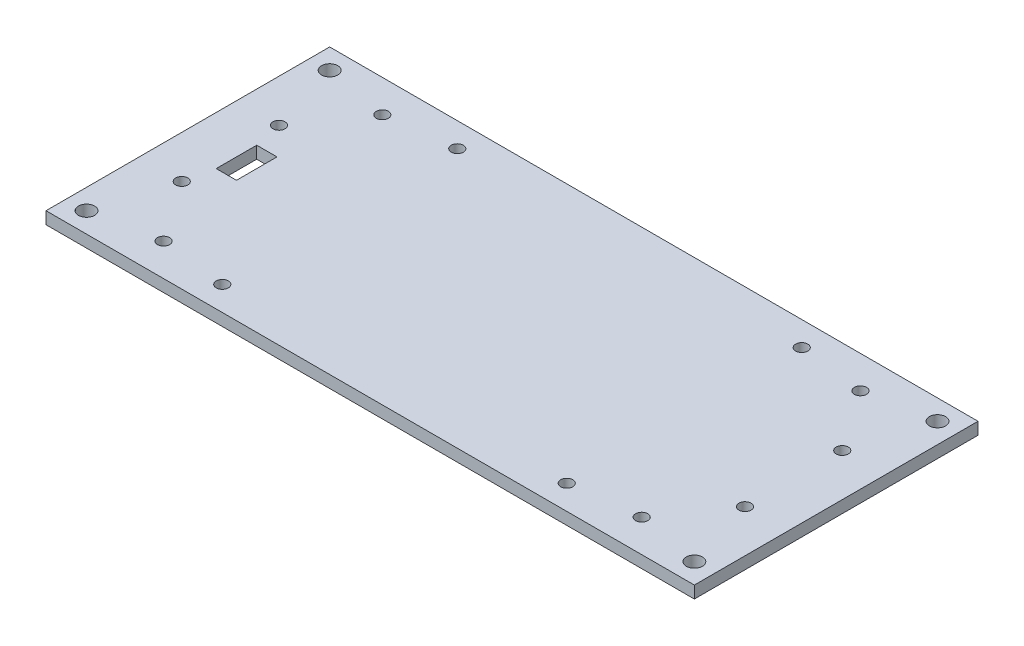
ISO-10303-21;
HEADER;
FILE_DESCRIPTION(('STEP AP214'),'2;1');
FILE_NAME('part.step','',(''),(''),'','','');
FILE_SCHEMA(('AUTOMOTIVE_DESIGN { 1 0 10303 214 1 1 1 1 }'));
ENDSEC;
DATA;
#1=APPLICATION_CONTEXT('core data for automotive mechanical design processes');
#2=APPLICATION_PROTOCOL_DEFINITION('international standard','automotive_design',2000,#1);
#3=PRODUCT_CONTEXT('',#1,'mechanical');
#4=PRODUCT('Part','Part','',(#3));
#5=PRODUCT_RELATED_PRODUCT_CATEGORY('part','',(#4));
#6=PRODUCT_DEFINITION_FORMATION('','',#4);
#7=PRODUCT_DEFINITION_CONTEXT('part definition',#1,'design');
#8=PRODUCT_DEFINITION('design','',#6,#7);
#9=PRODUCT_DEFINITION_SHAPE('','',#8);
#10=(LENGTH_UNIT() NAMED_UNIT(*) SI_UNIT(.MILLI.,.METRE.));
#11=(NAMED_UNIT(*) PLANE_ANGLE_UNIT() SI_UNIT($,.RADIAN.));
#12=(NAMED_UNIT(*) SI_UNIT($,.STERADIAN.) SOLID_ANGLE_UNIT());
#13=UNCERTAINTY_MEASURE_WITH_UNIT(LENGTH_MEASURE(1.E-05),#10,'distance_accuracy_value','');
#14=(GEOMETRIC_REPRESENTATION_CONTEXT(3) GLOBAL_UNCERTAINTY_ASSIGNED_CONTEXT((#13)) GLOBAL_UNIT_ASSIGNED_CONTEXT((#10,
#11,#12)) REPRESENTATION_CONTEXT('',''));
#15=CARTESIAN_POINT('',(0.,0.,0.));
#16=DIRECTION('',(0.,0.,1.));
#17=DIRECTION('',(1.,0.,0.));
#18=AXIS2_PLACEMENT_3D('',#15,#16,#17);
#19=CARTESIAN_POINT('',(80.,3.,-35.));
#20=DIRECTION('',(-1.,0.,0.));
#21=DIRECTION('',(0.,0.,1.));
#22=AXIS2_PLACEMENT_3D('',#19,#20,#21);
#23=PLANE('',#22);
#24=DIRECTION('',(0.,0.,-1.));
#25=VECTOR('',#24,1.);
#26=CARTESIAN_POINT('',(80.,0.,-35.));
#27=LINE('',#26,#25);
#28=CARTESIAN_POINT('',(80.,0.,35.));
#29=VERTEX_POINT('',#28);
#30=CARTESIAN_POINT('',(80.,0.,-35.));
#31=VERTEX_POINT('',#30);
#32=EDGE_CURVE('E206',#29,#31,#27,.T.);
#33=ORIENTED_EDGE('',*,*,#32,.T.);
#34=DIRECTION('',(0.,-1.,0.));
#35=VECTOR('',#34,1.);
#36=CARTESIAN_POINT('',(80.,3.,-35.));
#37=LINE('',#36,#35);
#38=CARTESIAN_POINT('',(80.,3.,-35.));
#39=VERTEX_POINT('',#38);
#40=EDGE_CURVE('E11',#39,#31,#37,.T.);
#41=ORIENTED_EDGE('',*,*,#40,.F.);
#42=DIRECTION('',(0.,0.,-1.));
#43=VECTOR('',#42,1.);
#44=CARTESIAN_POINT('',(80.,3.,-35.));
#45=LINE('',#44,#43);
#46=CARTESIAN_POINT('',(80.,3.,35.));
#47=VERTEX_POINT('',#46);
#48=EDGE_CURVE('E195',#47,#39,#45,.T.);
#49=ORIENTED_EDGE('',*,*,#48,.F.);
#50=DIRECTION('',(0.,-1.,0.));
#51=VECTOR('',#50,1.);
#52=CARTESIAN_POINT('',(80.,3.,35.));
#53=LINE('',#52,#51);
#54=EDGE_CURVE('E205',#47,#29,#53,.T.);
#55=ORIENTED_EDGE('',*,*,#54,.T.);
#56=EDGE_LOOP('',(#33,#41,#49,#55));
#57=FACE_BOUND('',#56,.T.);
#58=ADVANCED_FACE('F35',(#57),#23,.F.);
#59=CARTESIAN_POINT('',(-80.,3.,-35.));
#60=DIRECTION('',(0.,0.,1.));
#61=DIRECTION('',(1.,0.,0.));
#62=AXIS2_PLACEMENT_3D('',#59,#60,#61);
#63=PLANE('',#62);
#64=DIRECTION('',(-1.,0.,0.));
#65=VECTOR('',#64,1.);
#66=CARTESIAN_POINT('',(-80.,0.,-35.));
#67=LINE('',#66,#65);
#68=CARTESIAN_POINT('',(-80.,0.,-35.));
#69=VERTEX_POINT('',#68);
#70=EDGE_CURVE('E209',#31,#69,#67,.T.);
#71=ORIENTED_EDGE('',*,*,#70,.T.);
#72=DIRECTION('',(0.,-1.,0.));
#73=VECTOR('',#72,1.);
#74=CARTESIAN_POINT('',(-80.,3.,-35.));
#75=LINE('',#74,#73);
#76=CARTESIAN_POINT('',(-80.,3.,-35.));
#77=VERTEX_POINT('',#76);
#78=EDGE_CURVE('E43',#77,#69,#75,.T.);
#79=ORIENTED_EDGE('',*,*,#78,.F.);
#80=DIRECTION('',(-1.,0.,0.));
#81=VECTOR('',#80,1.);
#82=CARTESIAN_POINT('',(-80.,3.,-35.));
#83=LINE('',#82,#81);
#84=EDGE_CURVE('E198',#39,#77,#83,.T.);
#85=ORIENTED_EDGE('',*,*,#84,.F.);
#86=ORIENTED_EDGE('',*,*,#40,.T.);
#87=EDGE_LOOP('',(#71,#79,#85,#86));
#88=FACE_BOUND('',#87,.T.);
#89=ADVANCED_FACE('F274',(#88),#63,.F.);
#90=CARTESIAN_POINT('',(-80.,3.,-35.));
#91=DIRECTION('',(1.,0.,0.));
#92=DIRECTION('',(0.,0.,-1.));
#93=AXIS2_PLACEMENT_3D('',#90,#91,#92);
#94=PLANE('',#93);
#95=DIRECTION('',(0.,0.,1.));
#96=VECTOR('',#95,1.);
#97=CARTESIAN_POINT('',(-80.,0.,-35.));
#98=LINE('',#97,#96);
#99=CARTESIAN_POINT('',(-80.,0.,35.));
#100=VERTEX_POINT('',#99);
#101=EDGE_CURVE('E211',#69,#100,#98,.T.);
#102=ORIENTED_EDGE('',*,*,#101,.T.);
#103=DIRECTION('',(0.,-1.,0.));
#104=VECTOR('',#103,1.);
#105=CARTESIAN_POINT('',(-80.,3.,35.));
#106=LINE('',#105,#104);
#107=CARTESIAN_POINT('',(-80.,3.,35.));
#108=VERTEX_POINT('',#107);
#109=EDGE_CURVE('E216',#108,#100,#106,.T.);
#110=ORIENTED_EDGE('',*,*,#109,.F.);
#111=DIRECTION('',(0.,0.,1.));
#112=VECTOR('',#111,1.);
#113=CARTESIAN_POINT('',(-80.,3.,-35.));
#114=LINE('',#113,#112);
#115=EDGE_CURVE('E201',#77,#108,#114,.T.);
#116=ORIENTED_EDGE('',*,*,#115,.F.);
#117=ORIENTED_EDGE('',*,*,#78,.T.);
#118=EDGE_LOOP('',(#102,#110,#116,#117));
#119=FACE_BOUND('',#118,.T.);
#120=ADVANCED_FACE('F279',(#119),#94,.F.);
#121=CARTESIAN_POINT('',(-80.,3.,35.));
#122=DIRECTION('',(0.,0.,-1.));
#123=DIRECTION('',(-1.,0.,0.));
#124=AXIS2_PLACEMENT_3D('',#121,#122,#123);
#125=PLANE('',#124);
#126=DIRECTION('',(1.,0.,0.));
#127=VECTOR('',#126,1.);
#128=CARTESIAN_POINT('',(-80.,0.,35.));
#129=LINE('',#128,#127);
#130=EDGE_CURVE('E199',#100,#29,#129,.T.);
#131=ORIENTED_EDGE('',*,*,#130,.T.);
#132=ORIENTED_EDGE('',*,*,#54,.F.);
#133=DIRECTION('',(1.,0.,0.));
#134=VECTOR('',#133,1.);
#135=CARTESIAN_POINT('',(-80.,3.,35.));
#136=LINE('',#135,#134);
#137=EDGE_CURVE('E203',#108,#47,#136,.T.);
#138=ORIENTED_EDGE('',*,*,#137,.F.);
#139=ORIENTED_EDGE('',*,*,#109,.T.);
#140=EDGE_LOOP('',(#131,#132,#138,#139));
#141=FACE_BOUND('',#140,.T.);
#142=ADVANCED_FACE('F295',(#141),#125,.F.);
#143=CARTESIAN_POINT('',(0.,3.,0.));
#144=DIRECTION('',(0.,1.,0.));
#145=DIRECTION('',(0.,0.,1.));
#146=AXIS2_PLACEMENT_3D('',#143,#144,#145);
#147=PLANE('',#146);
#148=DIRECTION('',(0.,0.,-1.));
#149=VECTOR('',#148,1.);
#150=CARTESIAN_POINT('',(-63.,3.,0.));
#151=LINE('',#150,#149);
#152=CARTESIAN_POINT('',(-63.,3.,5.));
#153=VERTEX_POINT('',#152);
#154=CARTESIAN_POINT('',(-63.,3.,-5.));
#155=VERTEX_POINT('',#154);
#156=EDGE_CURVE('E134',#153,#155,#151,.T.);
#157=ORIENTED_EDGE('',*,*,#156,.F.);
#158=DIRECTION('',(1.,0.,0.));
#159=VECTOR('',#158,1.);
#160=CARTESIAN_POINT('',(0.,3.,5.));
#161=LINE('',#160,#159);
#162=CARTESIAN_POINT('',(-68.,3.,5.));
#163=VERTEX_POINT('',#162);
#164=EDGE_CURVE('E127',#163,#153,#161,.T.);
#165=ORIENTED_EDGE('',*,*,#164,.F.);
#166=DIRECTION('',(0.,0.,1.));
#167=VECTOR('',#166,1.);
#168=CARTESIAN_POINT('',(-68.,3.,0.));
#169=LINE('',#168,#167);
#170=CARTESIAN_POINT('',(-68.,3.,-5.));
#171=VERTEX_POINT('',#170);
#172=EDGE_CURVE('E107',#171,#163,#169,.T.);
#173=ORIENTED_EDGE('',*,*,#172,.F.);
#174=DIRECTION('',(-1.,0.,0.));
#175=VECTOR('',#174,1.);
#176=CARTESIAN_POINT('',(0.,3.,-5.));
#177=LINE('',#176,#175);
#178=EDGE_CURVE('E132',#155,#171,#177,.T.);
#179=ORIENTED_EDGE('',*,*,#178,.F.);
#180=EDGE_LOOP('',(#157,#165,#173,#179));
#181=FACE_BOUND('',#180,.T.);
#182=CARTESIAN_POINT('',(-42.5,3.,29.));
#183=DIRECTION('',(0.,1.,0.));
#184=DIRECTION('',(0.,0.,1.));
#185=AXIS2_PLACEMENT_3D('',#182,#183,#184);
#186=CIRCLE('',#185,1.5);
#187=CARTESIAN_POINT('',(-42.5,3.,30.5));
#188=VERTEX_POINT('',#187);
#189=EDGE_CURVE('E137',#188,#188,#186,.T.);
#190=ORIENTED_EDGE('',*,*,#189,.F.);
#191=EDGE_LOOP('',(#190));
#192=FACE_BOUND('',#191,.T.);
#193=CARTESIAN_POINT('',(42.5,3.,29.));
#194=DIRECTION('',(0.,1.,0.));
#195=DIRECTION('',(0.,0.,1.));
#196=AXIS2_PLACEMENT_3D('',#193,#194,#195);
#197=CIRCLE('',#196,1.5);
#198=CARTESIAN_POINT('',(42.5,3.,30.5));
#199=VERTEX_POINT('',#198);
#200=EDGE_CURVE('E141',#199,#199,#197,.T.);
#201=ORIENTED_EDGE('',*,*,#200,.F.);
#202=EDGE_LOOP('',(#201));
#203=FACE_BOUND('',#202,.T.);
#204=CARTESIAN_POINT('',(42.5,3.,-29.));
#205=DIRECTION('',(0.,1.,0.));
#206=DIRECTION('',(0.,0.,1.));
#207=AXIS2_PLACEMENT_3D('',#204,#205,#206);
#208=CIRCLE('',#207,1.5);
#209=CARTESIAN_POINT('',(42.5,3.,-27.5));
#210=VERTEX_POINT('',#209);
#211=EDGE_CURVE('E136',#210,#210,#208,.T.);
#212=ORIENTED_EDGE('',*,*,#211,.F.);
#213=EDGE_LOOP('',(#212));
#214=FACE_BOUND('',#213,.T.);
#215=CARTESIAN_POINT('',(-42.5,3.,-29.));
#216=DIRECTION('',(0.,1.,0.));
#217=DIRECTION('',(0.,0.,1.));
#218=AXIS2_PLACEMENT_3D('',#215,#216,#217);
#219=CIRCLE('',#218,1.5);
#220=CARTESIAN_POINT('',(-42.5,3.,-27.5));
#221=VERTEX_POINT('',#220);
#222=EDGE_CURVE('E146',#221,#221,#219,.T.);
#223=ORIENTED_EDGE('',*,*,#222,.F.);
#224=EDGE_LOOP('',(#223));
#225=FACE_BOUND('',#224,.T.);
#226=CARTESIAN_POINT('',(-69.5,3.,12.));
#227=DIRECTION('',(0.,1.,0.));
#228=DIRECTION('',(0.,0.,1.));
#229=AXIS2_PLACEMENT_3D('',#226,#227,#228);
#230=CIRCLE('',#229,1.5);
#231=CARTESIAN_POINT('',(-69.5,3.,13.5));
#232=VERTEX_POINT('',#231);
#233=EDGE_CURVE('E150',#232,#232,#230,.T.);
#234=ORIENTED_EDGE('',*,*,#233,.F.);
#235=EDGE_LOOP('',(#234));
#236=FACE_BOUND('',#235,.T.);
#237=CARTESIAN_POINT('',(69.5,3.,12.));
#238=DIRECTION('',(0.,1.,0.));
#239=DIRECTION('',(0.,0.,1.));
#240=AXIS2_PLACEMENT_3D('',#237,#238,#239);
#241=CIRCLE('',#240,1.5);
#242=CARTESIAN_POINT('',(69.5,3.,13.5));
#243=VERTEX_POINT('',#242);
#244=EDGE_CURVE('E154',#243,#243,#241,.T.);
#245=ORIENTED_EDGE('',*,*,#244,.F.);
#246=EDGE_LOOP('',(#245));
#247=FACE_BOUND('',#246,.T.);
#248=CARTESIAN_POINT('',(69.5,3.,-12.));
#249=DIRECTION('',(0.,1.,0.));
#250=DIRECTION('',(0.,0.,1.));
#251=AXIS2_PLACEMENT_3D('',#248,#249,#250);
#252=CIRCLE('',#251,1.5);
#253=CARTESIAN_POINT('',(69.5,3.,-10.5));
#254=VERTEX_POINT('',#253);
#255=EDGE_CURVE('E157',#254,#254,#252,.T.);
#256=ORIENTED_EDGE('',*,*,#255,.F.);
#257=EDGE_LOOP('',(#256));
#258=FACE_BOUND('',#257,.T.);
#259=CARTESIAN_POINT('',(-69.5,3.,-12.));
#260=DIRECTION('',(0.,1.,0.));
#261=DIRECTION('',(0.,0.,1.));
#262=AXIS2_PLACEMENT_3D('',#259,#260,#261);
#263=CIRCLE('',#262,1.5);
#264=CARTESIAN_POINT('',(-69.5,3.,-10.5));
#265=VERTEX_POINT('',#264);
#266=EDGE_CURVE('E160',#265,#265,#263,.T.);
#267=ORIENTED_EDGE('',*,*,#266,.F.);
#268=EDGE_LOOP('',(#267));
#269=FACE_BOUND('',#268,.T.);
#270=CARTESIAN_POINT('',(-59.,3.,27.));
#271=DIRECTION('',(0.,1.,0.));
#272=DIRECTION('',(0.,0.,1.));
#273=AXIS2_PLACEMENT_3D('',#270,#271,#272);
#274=CIRCLE('',#273,1.5);
#275=CARTESIAN_POINT('',(-59.,3.,28.5));
#276=VERTEX_POINT('',#275);
#277=EDGE_CURVE('E165',#276,#276,#274,.T.);
#278=ORIENTED_EDGE('',*,*,#277,.F.);
#279=EDGE_LOOP('',(#278));
#280=FACE_BOUND('',#279,.T.);
#281=CARTESIAN_POINT('',(59.,3.,27.));
#282=DIRECTION('',(0.,1.,0.));
#283=DIRECTION('',(0.,0.,1.));
#284=AXIS2_PLACEMENT_3D('',#281,#282,#283);
#285=CIRCLE('',#284,1.5);
#286=CARTESIAN_POINT('',(59.,3.,28.5));
#287=VERTEX_POINT('',#286);
#288=EDGE_CURVE('E169',#287,#287,#285,.T.);
#289=ORIENTED_EDGE('',*,*,#288,.F.);
#290=EDGE_LOOP('',(#289));
#291=FACE_BOUND('',#290,.T.);
#292=CARTESIAN_POINT('',(59.,3.,-27.));
#293=DIRECTION('',(0.,1.,0.));
#294=DIRECTION('',(0.,0.,1.));
#295=AXIS2_PLACEMENT_3D('',#292,#293,#294);
#296=CIRCLE('',#295,1.5);
#297=CARTESIAN_POINT('',(59.,3.,-25.5));
#298=VERTEX_POINT('',#297);
#299=EDGE_CURVE('E172',#298,#298,#296,.T.);
#300=ORIENTED_EDGE('',*,*,#299,.F.);
#301=EDGE_LOOP('',(#300));
#302=FACE_BOUND('',#301,.T.);
#303=CARTESIAN_POINT('',(-59.,3.,-27.));
#304=DIRECTION('',(0.,1.,0.));
#305=DIRECTION('',(0.,0.,1.));
#306=AXIS2_PLACEMENT_3D('',#303,#304,#305);
#307=CIRCLE('',#306,1.5);
#308=CARTESIAN_POINT('',(-59.,3.,-25.5));
#309=VERTEX_POINT('',#308);
#310=EDGE_CURVE('E175',#309,#309,#307,.T.);
#311=ORIENTED_EDGE('',*,*,#310,.F.);
#312=EDGE_LOOP('',(#311));
#313=FACE_BOUND('',#312,.T.);
#314=CARTESIAN_POINT('',(-75.,3.,30.));
#315=DIRECTION('',(0.,1.,0.));
#316=DIRECTION('',(0.,0.,1.));
#317=AXIS2_PLACEMENT_3D('',#314,#315,#316);
#318=CIRCLE('',#317,2.);
#319=CARTESIAN_POINT('',(-75.,3.,32.));
#320=VERTEX_POINT('',#319);
#321=EDGE_CURVE('E180',#320,#320,#318,.T.);
#322=ORIENTED_EDGE('',*,*,#321,.F.);
#323=EDGE_LOOP('',(#322));
#324=FACE_BOUND('',#323,.T.);
#325=CARTESIAN_POINT('',(75.,3.,30.));
#326=DIRECTION('',(0.,1.,0.));
#327=DIRECTION('',(0.,0.,1.));
#328=AXIS2_PLACEMENT_3D('',#325,#326,#327);
#329=CIRCLE('',#328,2.);
#330=CARTESIAN_POINT('',(75.,3.,32.));
#331=VERTEX_POINT('',#330);
#332=EDGE_CURVE('E184',#331,#331,#329,.T.);
#333=ORIENTED_EDGE('',*,*,#332,.F.);
#334=EDGE_LOOP('',(#333));
#335=FACE_BOUND('',#334,.T.);
#336=CARTESIAN_POINT('',(75.,3.,-30.));
#337=DIRECTION('',(0.,1.,0.));
#338=DIRECTION('',(0.,0.,1.));
#339=AXIS2_PLACEMENT_3D('',#336,#337,#338);
#340=CIRCLE('',#339,2.);
#341=CARTESIAN_POINT('',(75.,3.,-28.));
#342=VERTEX_POINT('',#341);
#343=EDGE_CURVE('E187',#342,#342,#340,.T.);
#344=ORIENTED_EDGE('',*,*,#343,.F.);
#345=EDGE_LOOP('',(#344));
#346=FACE_BOUND('',#345,.T.);
#347=CARTESIAN_POINT('',(-75.,3.,-30.));
#348=DIRECTION('',(0.,1.,0.));
#349=DIRECTION('',(0.,0.,1.));
#350=AXIS2_PLACEMENT_3D('',#347,#348,#349);
#351=CIRCLE('',#350,2.);
#352=CARTESIAN_POINT('',(-75.,3.,-28.));
#353=VERTEX_POINT('',#352);
#354=EDGE_CURVE('E190',#353,#353,#351,.T.);
#355=ORIENTED_EDGE('',*,*,#354,.F.);
#356=EDGE_LOOP('',(#355));
#357=FACE_BOUND('',#356,.T.);
#358=ORIENTED_EDGE('',*,*,#48,.T.);
#359=ORIENTED_EDGE('',*,*,#84,.T.);
#360=ORIENTED_EDGE('',*,*,#115,.T.);
#361=ORIENTED_EDGE('',*,*,#137,.T.);
#362=EDGE_LOOP('',(#358,#359,#360,#361));
#363=FACE_BOUND('',#362,.T.);
#364=ADVANCED_FACE('F291',(#181,#192,#203,#214,#225,#236,#247,#258,#269,#280,#291,#302,#313,
#324,#335,#346,#357,#363),#147,.T.);
#365=CARTESIAN_POINT('',(0.,0.,0.));
#366=DIRECTION('',(0.,1.,0.));
#367=DIRECTION('',(0.,0.,1.));
#368=AXIS2_PLACEMENT_3D('',#365,#366,#367);
#369=PLANE('',#368);
#370=DIRECTION('',(-1.,0.,0.));
#371=VECTOR('',#370,1.);
#372=CARTESIAN_POINT('',(-63.,0.,5.));
#373=LINE('',#372,#371);
#374=CARTESIAN_POINT('',(-63.,0.,5.));
#375=VERTEX_POINT('',#374);
#376=CARTESIAN_POINT('',(-68.,0.,5.));
#377=VERTEX_POINT('',#376);
#378=EDGE_CURVE('E113',#375,#377,#373,.T.);
#379=ORIENTED_EDGE('',*,*,#378,.F.);
#380=DIRECTION('',(0.,0.,1.));
#381=VECTOR('',#380,1.);
#382=CARTESIAN_POINT('',(-63.,0.,5.));
#383=LINE('',#382,#381);
#384=CARTESIAN_POINT('',(-63.,0.,-5.));
#385=VERTEX_POINT('',#384);
#386=EDGE_CURVE('E59',#385,#375,#383,.T.);
#387=ORIENTED_EDGE('',*,*,#386,.F.);
#388=DIRECTION('',(1.,0.,0.));
#389=VECTOR('',#388,1.);
#390=CARTESIAN_POINT('',(-63.,0.,-5.));
#391=LINE('',#390,#389);
#392=CARTESIAN_POINT('',(-68.,0.,-5.));
#393=VERTEX_POINT('',#392);
#394=EDGE_CURVE('E120',#393,#385,#391,.T.);
#395=ORIENTED_EDGE('',*,*,#394,.F.);
#396=DIRECTION('',(0.,0.,-1.));
#397=VECTOR('',#396,1.);
#398=CARTESIAN_POINT('',(-68.,0.,5.));
#399=LINE('',#398,#397);
#400=EDGE_CURVE('E104',#377,#393,#399,.T.);
#401=ORIENTED_EDGE('',*,*,#400,.F.);
#402=EDGE_LOOP('',(#379,#387,#395,#401));
#403=FACE_BOUND('',#402,.T.);
#404=CARTESIAN_POINT('',(-42.5,0.,29.));
#405=DIRECTION('',(0.,1.,0.));
#406=DIRECTION('',(0.,0.,1.));
#407=AXIS2_PLACEMENT_3D('',#404,#405,#406);
#408=CIRCLE('',#407,1.5);
#409=CARTESIAN_POINT('',(-42.5,0.,30.5));
#410=VERTEX_POINT('',#409);
#411=EDGE_CURVE('E38',#410,#410,#408,.T.);
#412=ORIENTED_EDGE('',*,*,#411,.T.);
#413=EDGE_LOOP('',(#412));
#414=FACE_BOUND('',#413,.T.);
#415=CARTESIAN_POINT('',(42.5,0.,29.));
#416=DIRECTION('',(0.,1.,0.));
#417=DIRECTION('',(0.,0.,1.));
#418=AXIS2_PLACEMENT_3D('',#415,#416,#417);
#419=CIRCLE('',#418,1.5);
#420=CARTESIAN_POINT('',(42.5,0.,30.5));
#421=VERTEX_POINT('',#420);
#422=EDGE_CURVE('E251',#421,#421,#419,.T.);
#423=ORIENTED_EDGE('',*,*,#422,.T.);
#424=EDGE_LOOP('',(#423));
#425=FACE_BOUND('',#424,.T.);
#426=CARTESIAN_POINT('',(42.5,0.,-29.));
#427=DIRECTION('',(0.,1.,0.));
#428=DIRECTION('',(0.,0.,1.));
#429=AXIS2_PLACEMENT_3D('',#426,#427,#428);
#430=CIRCLE('',#429,1.5);
#431=CARTESIAN_POINT('',(42.5,0.,-27.5));
#432=VERTEX_POINT('',#431);
#433=EDGE_CURVE('E140',#432,#432,#430,.T.);
#434=ORIENTED_EDGE('',*,*,#433,.T.);
#435=EDGE_LOOP('',(#434));
#436=FACE_BOUND('',#435,.T.);
#437=CARTESIAN_POINT('',(-42.5,0.,-29.));
#438=DIRECTION('',(0.,1.,0.));
#439=DIRECTION('',(0.,0.,1.));
#440=AXIS2_PLACEMENT_3D('',#437,#438,#439);
#441=CIRCLE('',#440,1.5);
#442=CARTESIAN_POINT('',(-42.5,0.,-27.5));
#443=VERTEX_POINT('',#442);
#444=EDGE_CURVE('E149',#443,#443,#441,.T.);
#445=ORIENTED_EDGE('',*,*,#444,.T.);
#446=EDGE_LOOP('',(#445));
#447=FACE_BOUND('',#446,.T.);
#448=CARTESIAN_POINT('',(-69.5,0.,12.));
#449=DIRECTION('',(0.,1.,0.));
#450=DIRECTION('',(0.,0.,1.));
#451=AXIS2_PLACEMENT_3D('',#448,#449,#450);
#452=CIRCLE('',#451,1.5);
#453=CARTESIAN_POINT('',(-69.5,0.,13.5));
#454=VERTEX_POINT('',#453);
#455=EDGE_CURVE('E164',#454,#454,#452,.T.);
#456=ORIENTED_EDGE('',*,*,#455,.T.);
#457=EDGE_LOOP('',(#456));
#458=FACE_BOUND('',#457,.T.);
#459=CARTESIAN_POINT('',(69.5,0.,12.));
#460=DIRECTION('',(0.,1.,0.));
#461=DIRECTION('',(0.,0.,1.));
#462=AXIS2_PLACEMENT_3D('',#459,#460,#461);
#463=CIRCLE('',#462,1.5);
#464=CARTESIAN_POINT('',(69.5,0.,13.5));
#465=VERTEX_POINT('',#464);
#466=EDGE_CURVE('E243',#465,#465,#463,.T.);
#467=ORIENTED_EDGE('',*,*,#466,.T.);
#468=EDGE_LOOP('',(#467));
#469=FACE_BOUND('',#468,.T.);
#470=CARTESIAN_POINT('',(69.5,0.,-12.));
#471=DIRECTION('',(0.,1.,0.));
#472=DIRECTION('',(0.,0.,1.));
#473=AXIS2_PLACEMENT_3D('',#470,#471,#472);
#474=CIRCLE('',#473,1.5);
#475=CARTESIAN_POINT('',(69.5,0.,-10.5));
#476=VERTEX_POINT('',#475);
#477=EDGE_CURVE('E153',#476,#476,#474,.T.);
#478=ORIENTED_EDGE('',*,*,#477,.T.);
#479=EDGE_LOOP('',(#478));
#480=FACE_BOUND('',#479,.T.);
#481=CARTESIAN_POINT('',(-69.5,0.,-12.));
#482=DIRECTION('',(0.,1.,0.));
#483=DIRECTION('',(0.,0.,1.));
#484=AXIS2_PLACEMENT_3D('',#481,#482,#483);
#485=CIRCLE('',#484,1.5);
#486=CARTESIAN_POINT('',(-69.5,0.,-10.5));
#487=VERTEX_POINT('',#486);
#488=EDGE_CURVE('E163',#487,#487,#485,.T.);
#489=ORIENTED_EDGE('',*,*,#488,.T.);
#490=EDGE_LOOP('',(#489));
#491=FACE_BOUND('',#490,.T.);
#492=CARTESIAN_POINT('',(-59.,0.,27.));
#493=DIRECTION('',(0.,1.,0.));
#494=DIRECTION('',(0.,0.,1.));
#495=AXIS2_PLACEMENT_3D('',#492,#493,#494);
#496=CIRCLE('',#495,1.5);
#497=CARTESIAN_POINT('',(-59.,0.,28.5));
#498=VERTEX_POINT('',#497);
#499=EDGE_CURVE('E179',#498,#498,#496,.T.);
#500=ORIENTED_EDGE('',*,*,#499,.T.);
#501=EDGE_LOOP('',(#500));
#502=FACE_BOUND('',#501,.T.);
#503=CARTESIAN_POINT('',(59.,0.,27.));
#504=DIRECTION('',(0.,1.,0.));
#505=DIRECTION('',(0.,0.,1.));
#506=AXIS2_PLACEMENT_3D('',#503,#504,#505);
#507=CIRCLE('',#506,1.5);
#508=CARTESIAN_POINT('',(59.,0.,28.5));
#509=VERTEX_POINT('',#508);
#510=EDGE_CURVE('E234',#509,#509,#507,.T.);
#511=ORIENTED_EDGE('',*,*,#510,.T.);
#512=EDGE_LOOP('',(#511));
#513=FACE_BOUND('',#512,.T.);
#514=CARTESIAN_POINT('',(59.,0.,-27.));
#515=DIRECTION('',(0.,1.,0.));
#516=DIRECTION('',(0.,0.,1.));
#517=AXIS2_PLACEMENT_3D('',#514,#515,#516);
#518=CIRCLE('',#517,1.5);
#519=CARTESIAN_POINT('',(59.,0.,-25.5));
#520=VERTEX_POINT('',#519);
#521=EDGE_CURVE('E168',#520,#520,#518,.T.);
#522=ORIENTED_EDGE('',*,*,#521,.T.);
#523=EDGE_LOOP('',(#522));
#524=FACE_BOUND('',#523,.T.);
#525=CARTESIAN_POINT('',(-59.,0.,-27.));
#526=DIRECTION('',(0.,1.,0.));
#527=DIRECTION('',(0.,0.,1.));
#528=AXIS2_PLACEMENT_3D('',#525,#526,#527);
#529=CIRCLE('',#528,1.5);
#530=CARTESIAN_POINT('',(-59.,0.,-25.5));
#531=VERTEX_POINT('',#530);
#532=EDGE_CURVE('E178',#531,#531,#529,.T.);
#533=ORIENTED_EDGE('',*,*,#532,.T.);
#534=EDGE_LOOP('',(#533));
#535=FACE_BOUND('',#534,.T.);
#536=CARTESIAN_POINT('',(-75.,0.,30.));
#537=DIRECTION('',(0.,1.,0.));
#538=DIRECTION('',(0.,0.,1.));
#539=AXIS2_PLACEMENT_3D('',#536,#537,#538);
#540=CIRCLE('',#539,2.);
#541=CARTESIAN_POINT('',(-75.,0.,32.));
#542=VERTEX_POINT('',#541);
#543=EDGE_CURVE('E194',#542,#542,#540,.T.);
#544=ORIENTED_EDGE('',*,*,#543,.T.);
#545=EDGE_LOOP('',(#544));
#546=FACE_BOUND('',#545,.T.);
#547=CARTESIAN_POINT('',(75.,0.,30.));
#548=DIRECTION('',(0.,1.,0.));
#549=DIRECTION('',(0.,0.,1.));
#550=AXIS2_PLACEMENT_3D('',#547,#548,#549);
#551=CIRCLE('',#550,2.);
#552=CARTESIAN_POINT('',(75.,0.,32.));
#553=VERTEX_POINT('',#552);
#554=EDGE_CURVE('E225',#553,#553,#551,.T.);
#555=ORIENTED_EDGE('',*,*,#554,.T.);
#556=EDGE_LOOP('',(#555));
#557=FACE_BOUND('',#556,.T.);
#558=CARTESIAN_POINT('',(75.,0.,-30.));
#559=DIRECTION('',(0.,1.,0.));
#560=DIRECTION('',(0.,0.,1.));
#561=AXIS2_PLACEMENT_3D('',#558,#559,#560);
#562=CIRCLE('',#561,2.);
#563=CARTESIAN_POINT('',(75.,0.,-28.));
#564=VERTEX_POINT('',#563);
#565=EDGE_CURVE('E183',#564,#564,#562,.T.);
#566=ORIENTED_EDGE('',*,*,#565,.T.);
#567=EDGE_LOOP('',(#566));
#568=FACE_BOUND('',#567,.T.);
#569=CARTESIAN_POINT('',(-75.,0.,-30.));
#570=DIRECTION('',(0.,1.,0.));
#571=DIRECTION('',(0.,0.,1.));
#572=AXIS2_PLACEMENT_3D('',#569,#570,#571);
#573=CIRCLE('',#572,2.);
#574=CARTESIAN_POINT('',(-75.,0.,-28.));
#575=VERTEX_POINT('',#574);
#576=EDGE_CURVE('E193',#575,#575,#573,.T.);
#577=ORIENTED_EDGE('',*,*,#576,.T.);
#578=EDGE_LOOP('',(#577));
#579=FACE_BOUND('',#578,.T.);
#580=ORIENTED_EDGE('',*,*,#32,.F.);
#581=ORIENTED_EDGE('',*,*,#130,.F.);
#582=ORIENTED_EDGE('',*,*,#101,.F.);
#583=ORIENTED_EDGE('',*,*,#70,.F.);
#584=EDGE_LOOP('',(#580,#581,#582,#583));
#585=FACE_BOUND('',#584,.T.);
#586=ADVANCED_FACE('F117',(#403,#414,#425,#436,#447,#458,#469,#480,#491,#502,#513,#524,#535,
#546,#557,#568,#579,#585),#369,.F.);
#587=CARTESIAN_POINT('',(-75.,-117.,-30.));
#588=DIRECTION('',(0.,1.,0.));
#589=DIRECTION('',(0.,0.,1.));
#590=AXIS2_PLACEMENT_3D('',#587,#588,#589);
#591=CYLINDRICAL_SURFACE('',#590,2.);
#592=ORIENTED_EDGE('',*,*,#354,.T.);
#593=EDGE_LOOP('',(#592));
#594=FACE_BOUND('',#593,.T.);
#595=ORIENTED_EDGE('',*,*,#576,.F.);
#596=EDGE_LOOP('',(#595));
#597=FACE_BOUND('',#596,.T.);
#598=ADVANCED_FACE('F306',(#594,#597),#591,.F.);
#599=CARTESIAN_POINT('',(75.,-117.,-30.));
#600=DIRECTION('',(0.,1.,0.));
#601=DIRECTION('',(0.,0.,1.));
#602=AXIS2_PLACEMENT_3D('',#599,#600,#601);
#603=CYLINDRICAL_SURFACE('',#602,2.);
#604=ORIENTED_EDGE('',*,*,#343,.T.);
#605=EDGE_LOOP('',(#604));
#606=FACE_BOUND('',#605,.T.);
#607=ORIENTED_EDGE('',*,*,#565,.F.);
#608=EDGE_LOOP('',(#607));
#609=FACE_BOUND('',#608,.T.);
#610=ADVANCED_FACE('F312',(#606,#609),#603,.F.);
#611=CARTESIAN_POINT('',(75.,-117.,30.));
#612=DIRECTION('',(0.,1.,0.));
#613=DIRECTION('',(0.,0.,1.));
#614=AXIS2_PLACEMENT_3D('',#611,#612,#613);
#615=CYLINDRICAL_SURFACE('',#614,2.);
#616=ORIENTED_EDGE('',*,*,#332,.T.);
#617=EDGE_LOOP('',(#616));
#618=FACE_BOUND('',#617,.T.);
#619=ORIENTED_EDGE('',*,*,#554,.F.);
#620=EDGE_LOOP('',(#619));
#621=FACE_BOUND('',#620,.T.);
#622=ADVANCED_FACE('F316',(#618,#621),#615,.F.);
#623=CARTESIAN_POINT('',(-75.,-117.,30.));
#624=DIRECTION('',(0.,1.,0.));
#625=DIRECTION('',(0.,0.,1.));
#626=AXIS2_PLACEMENT_3D('',#623,#624,#625);
#627=CYLINDRICAL_SURFACE('',#626,2.);
#628=ORIENTED_EDGE('',*,*,#321,.T.);
#629=EDGE_LOOP('',(#628));
#630=FACE_BOUND('',#629,.T.);
#631=ORIENTED_EDGE('',*,*,#543,.F.);
#632=EDGE_LOOP('',(#631));
#633=FACE_BOUND('',#632,.T.);
#634=ADVANCED_FACE('F320',(#630,#633),#627,.F.);
#635=CARTESIAN_POINT('',(-59.,-7.,-27.));
#636=DIRECTION('',(0.,1.,0.));
#637=DIRECTION('',(0.,0.,1.));
#638=AXIS2_PLACEMENT_3D('',#635,#636,#637);
#639=CYLINDRICAL_SURFACE('',#638,1.5);
#640=ORIENTED_EDGE('',*,*,#310,.T.);
#641=EDGE_LOOP('',(#640));
#642=FACE_BOUND('',#641,.T.);
#643=ORIENTED_EDGE('',*,*,#532,.F.);
#644=EDGE_LOOP('',(#643));
#645=FACE_BOUND('',#644,.T.);
#646=ADVANCED_FACE('F324',(#642,#645),#639,.F.);
#647=CARTESIAN_POINT('',(59.,-7.,-27.));
#648=DIRECTION('',(0.,1.,0.));
#649=DIRECTION('',(0.,0.,1.));
#650=AXIS2_PLACEMENT_3D('',#647,#648,#649);
#651=CYLINDRICAL_SURFACE('',#650,1.5);
#652=ORIENTED_EDGE('',*,*,#299,.T.);
#653=EDGE_LOOP('',(#652));
#654=FACE_BOUND('',#653,.T.);
#655=ORIENTED_EDGE('',*,*,#521,.F.);
#656=EDGE_LOOP('',(#655));
#657=FACE_BOUND('',#656,.T.);
#658=ADVANCED_FACE('F328',(#654,#657),#651,.F.);
#659=CARTESIAN_POINT('',(59.,-7.,27.));
#660=DIRECTION('',(0.,1.,0.));
#661=DIRECTION('',(0.,0.,1.));
#662=AXIS2_PLACEMENT_3D('',#659,#660,#661);
#663=CYLINDRICAL_SURFACE('',#662,1.5);
#664=ORIENTED_EDGE('',*,*,#288,.T.);
#665=EDGE_LOOP('',(#664));
#666=FACE_BOUND('',#665,.T.);
#667=ORIENTED_EDGE('',*,*,#510,.F.);
#668=EDGE_LOOP('',(#667));
#669=FACE_BOUND('',#668,.T.);
#670=ADVANCED_FACE('F332',(#666,#669),#663,.F.);
#671=CARTESIAN_POINT('',(-59.,-7.,27.));
#672=DIRECTION('',(0.,1.,0.));
#673=DIRECTION('',(0.,0.,1.));
#674=AXIS2_PLACEMENT_3D('',#671,#672,#673);
#675=CYLINDRICAL_SURFACE('',#674,1.5);
#676=ORIENTED_EDGE('',*,*,#277,.T.);
#677=EDGE_LOOP('',(#676));
#678=FACE_BOUND('',#677,.T.);
#679=ORIENTED_EDGE('',*,*,#499,.F.);
#680=EDGE_LOOP('',(#679));
#681=FACE_BOUND('',#680,.T.);
#682=ADVANCED_FACE('F336',(#678,#681),#675,.F.);
#683=CARTESIAN_POINT('',(-69.5,-7.,-12.));
#684=DIRECTION('',(0.,1.,0.));
#685=DIRECTION('',(0.,0.,1.));
#686=AXIS2_PLACEMENT_3D('',#683,#684,#685);
#687=CYLINDRICAL_SURFACE('',#686,1.5);
#688=ORIENTED_EDGE('',*,*,#266,.T.);
#689=EDGE_LOOP('',(#688));
#690=FACE_BOUND('',#689,.T.);
#691=ORIENTED_EDGE('',*,*,#488,.F.);
#692=EDGE_LOOP('',(#691));
#693=FACE_BOUND('',#692,.T.);
#694=ADVANCED_FACE('F340',(#690,#693),#687,.F.);
#695=CARTESIAN_POINT('',(69.5,-7.,-12.));
#696=DIRECTION('',(0.,1.,0.));
#697=DIRECTION('',(0.,0.,1.));
#698=AXIS2_PLACEMENT_3D('',#695,#696,#697);
#699=CYLINDRICAL_SURFACE('',#698,1.5);
#700=ORIENTED_EDGE('',*,*,#255,.T.);
#701=EDGE_LOOP('',(#700));
#702=FACE_BOUND('',#701,.T.);
#703=ORIENTED_EDGE('',*,*,#477,.F.);
#704=EDGE_LOOP('',(#703));
#705=FACE_BOUND('',#704,.T.);
#706=ADVANCED_FACE('F344',(#702,#705),#699,.F.);
#707=CARTESIAN_POINT('',(69.5,-7.,12.));
#708=DIRECTION('',(0.,1.,0.));
#709=DIRECTION('',(0.,0.,1.));
#710=AXIS2_PLACEMENT_3D('',#707,#708,#709);
#711=CYLINDRICAL_SURFACE('',#710,1.5);
#712=ORIENTED_EDGE('',*,*,#244,.T.);
#713=EDGE_LOOP('',(#712));
#714=FACE_BOUND('',#713,.T.);
#715=ORIENTED_EDGE('',*,*,#466,.F.);
#716=EDGE_LOOP('',(#715));
#717=FACE_BOUND('',#716,.T.);
#718=ADVANCED_FACE('F348',(#714,#717),#711,.F.);
#719=CARTESIAN_POINT('',(-69.5,-7.,12.));
#720=DIRECTION('',(0.,1.,0.));
#721=DIRECTION('',(0.,0.,1.));
#722=AXIS2_PLACEMENT_3D('',#719,#720,#721);
#723=CYLINDRICAL_SURFACE('',#722,1.5);
#724=ORIENTED_EDGE('',*,*,#233,.T.);
#725=EDGE_LOOP('',(#724));
#726=FACE_BOUND('',#725,.T.);
#727=ORIENTED_EDGE('',*,*,#455,.F.);
#728=EDGE_LOOP('',(#727));
#729=FACE_BOUND('',#728,.T.);
#730=ADVANCED_FACE('F352',(#726,#729),#723,.F.);
#731=CARTESIAN_POINT('',(-42.5,-7.,-29.));
#732=DIRECTION('',(0.,1.,0.));
#733=DIRECTION('',(0.,0.,1.));
#734=AXIS2_PLACEMENT_3D('',#731,#732,#733);
#735=CYLINDRICAL_SURFACE('',#734,1.5);
#736=ORIENTED_EDGE('',*,*,#222,.T.);
#737=EDGE_LOOP('',(#736));
#738=FACE_BOUND('',#737,.T.);
#739=ORIENTED_EDGE('',*,*,#444,.F.);
#740=EDGE_LOOP('',(#739));
#741=FACE_BOUND('',#740,.T.);
#742=ADVANCED_FACE('F356',(#738,#741),#735,.F.);
#743=CARTESIAN_POINT('',(42.5,-7.,-29.));
#744=DIRECTION('',(0.,1.,0.));
#745=DIRECTION('',(0.,0.,1.));
#746=AXIS2_PLACEMENT_3D('',#743,#744,#745);
#747=CYLINDRICAL_SURFACE('',#746,1.5);
#748=ORIENTED_EDGE('',*,*,#211,.T.);
#749=EDGE_LOOP('',(#748));
#750=FACE_BOUND('',#749,.T.);
#751=ORIENTED_EDGE('',*,*,#433,.F.);
#752=EDGE_LOOP('',(#751));
#753=FACE_BOUND('',#752,.T.);
#754=ADVANCED_FACE('F270',(#750,#753),#747,.F.);
#755=CARTESIAN_POINT('',(42.5,-7.,29.));
#756=DIRECTION('',(0.,1.,0.));
#757=DIRECTION('',(0.,0.,1.));
#758=AXIS2_PLACEMENT_3D('',#755,#756,#757);
#759=CYLINDRICAL_SURFACE('',#758,1.5);
#760=ORIENTED_EDGE('',*,*,#200,.T.);
#761=EDGE_LOOP('',(#760));
#762=FACE_BOUND('',#761,.T.);
#763=ORIENTED_EDGE('',*,*,#422,.F.);
#764=EDGE_LOOP('',(#763));
#765=FACE_BOUND('',#764,.T.);
#766=ADVANCED_FACE('F261',(#762,#765),#759,.F.);
#767=CARTESIAN_POINT('',(-42.5,-7.,29.));
#768=DIRECTION('',(0.,1.,0.));
#769=DIRECTION('',(0.,0.,1.));
#770=AXIS2_PLACEMENT_3D('',#767,#768,#769);
#771=CYLINDRICAL_SURFACE('',#770,1.5);
#772=ORIENTED_EDGE('',*,*,#189,.T.);
#773=EDGE_LOOP('',(#772));
#774=FACE_BOUND('',#773,.T.);
#775=ORIENTED_EDGE('',*,*,#411,.F.);
#776=EDGE_LOOP('',(#775));
#777=FACE_BOUND('',#776,.T.);
#778=ADVANCED_FACE('F258',(#774,#777),#771,.F.);
#779=CARTESIAN_POINT('',(-63.,5.,5.));
#780=DIRECTION('',(1.,0.,0.));
#781=DIRECTION('',(0.,0.,-1.));
#782=AXIS2_PLACEMENT_3D('',#779,#780,#781);
#783=PLANE('',#782);
#784=ORIENTED_EDGE('',*,*,#156,.T.);
#785=DIRECTION('',(0.,-1.,0.));
#786=VECTOR('',#785,1.);
#787=CARTESIAN_POINT('',(-63.,5.,-5.));
#788=LINE('',#787,#786);
#789=EDGE_CURVE('E125',#155,#385,#788,.T.);
#790=ORIENTED_EDGE('',*,*,#789,.T.);
#791=ORIENTED_EDGE('',*,*,#386,.T.);
#792=DIRECTION('',(0.,-1.,0.));
#793=VECTOR('',#792,1.);
#794=CARTESIAN_POINT('',(-63.,5.,5.));
#795=LINE('',#794,#793);
#796=EDGE_CURVE('E110',#153,#375,#795,.T.);
#797=ORIENTED_EDGE('',*,*,#796,.F.);
#798=EDGE_LOOP('',(#784,#790,#791,#797));
#799=FACE_BOUND('',#798,.T.);
#800=ADVANCED_FACE('F260',(#799),#783,.F.);
#801=CARTESIAN_POINT('',(-63.,5.,-5.));
#802=DIRECTION('',(0.,0.,-1.));
#803=DIRECTION('',(-1.,0.,0.));
#804=AXIS2_PLACEMENT_3D('',#801,#802,#803);
#805=PLANE('',#804);
#806=ORIENTED_EDGE('',*,*,#178,.T.);
#807=DIRECTION('',(0.,-1.,0.));
#808=VECTOR('',#807,1.);
#809=CARTESIAN_POINT('',(-68.,5.,-5.));
#810=LINE('',#809,#808);
#811=EDGE_CURVE('E109',#171,#393,#810,.T.);
#812=ORIENTED_EDGE('',*,*,#811,.T.);
#813=ORIENTED_EDGE('',*,*,#394,.T.);
#814=ORIENTED_EDGE('',*,*,#789,.F.);
#815=EDGE_LOOP('',(#806,#812,#813,#814));
#816=FACE_BOUND('',#815,.T.);
#817=ADVANCED_FACE('F268',(#816),#805,.F.);
#818=CARTESIAN_POINT('',(-68.,5.,5.));
#819=DIRECTION('',(-1.,0.,0.));
#820=DIRECTION('',(0.,0.,1.));
#821=AXIS2_PLACEMENT_3D('',#818,#819,#820);
#822=PLANE('',#821);
#823=ORIENTED_EDGE('',*,*,#172,.T.);
#824=DIRECTION('',(0.,-1.,0.));
#825=VECTOR('',#824,1.);
#826=CARTESIAN_POINT('',(-68.,5.,5.));
#827=LINE('',#826,#825);
#828=EDGE_CURVE('E51',#163,#377,#827,.T.);
#829=ORIENTED_EDGE('',*,*,#828,.T.);
#830=ORIENTED_EDGE('',*,*,#400,.T.);
#831=ORIENTED_EDGE('',*,*,#811,.F.);
#832=EDGE_LOOP('',(#823,#829,#830,#831));
#833=FACE_BOUND('',#832,.T.);
#834=ADVANCED_FACE('F101',(#833),#822,.F.);
#835=CARTESIAN_POINT('',(-63.,5.,5.));
#836=DIRECTION('',(0.,0.,1.));
#837=DIRECTION('',(1.,0.,0.));
#838=AXIS2_PLACEMENT_3D('',#835,#836,#837);
#839=PLANE('',#838);
#840=ORIENTED_EDGE('',*,*,#164,.T.);
#841=ORIENTED_EDGE('',*,*,#796,.T.);
#842=ORIENTED_EDGE('',*,*,#378,.T.);
#843=ORIENTED_EDGE('',*,*,#828,.F.);
#844=EDGE_LOOP('',(#840,#841,#842,#843));
#845=FACE_BOUND('',#844,.T.);
#846=ADVANCED_FACE('F114',(#845),#839,.F.);
#847=CLOSED_SHELL('',(#58,#89,#120,#142,#364,#586,#598,#610,#622,#634,#646,#658,#670,#682,#694,
#706,#718,#730,#742,#754,#766,#778,#800,#817,#834,#846));
#848=MANIFOLD_SOLID_BREP('B2',#847);
#849=ADVANCED_BREP_SHAPE_REPRESENTATION('',(#18,#848),#14);
#850=SHAPE_DEFINITION_REPRESENTATION(#9,#849);
ENDSEC;
END-ISO-10303-21;
